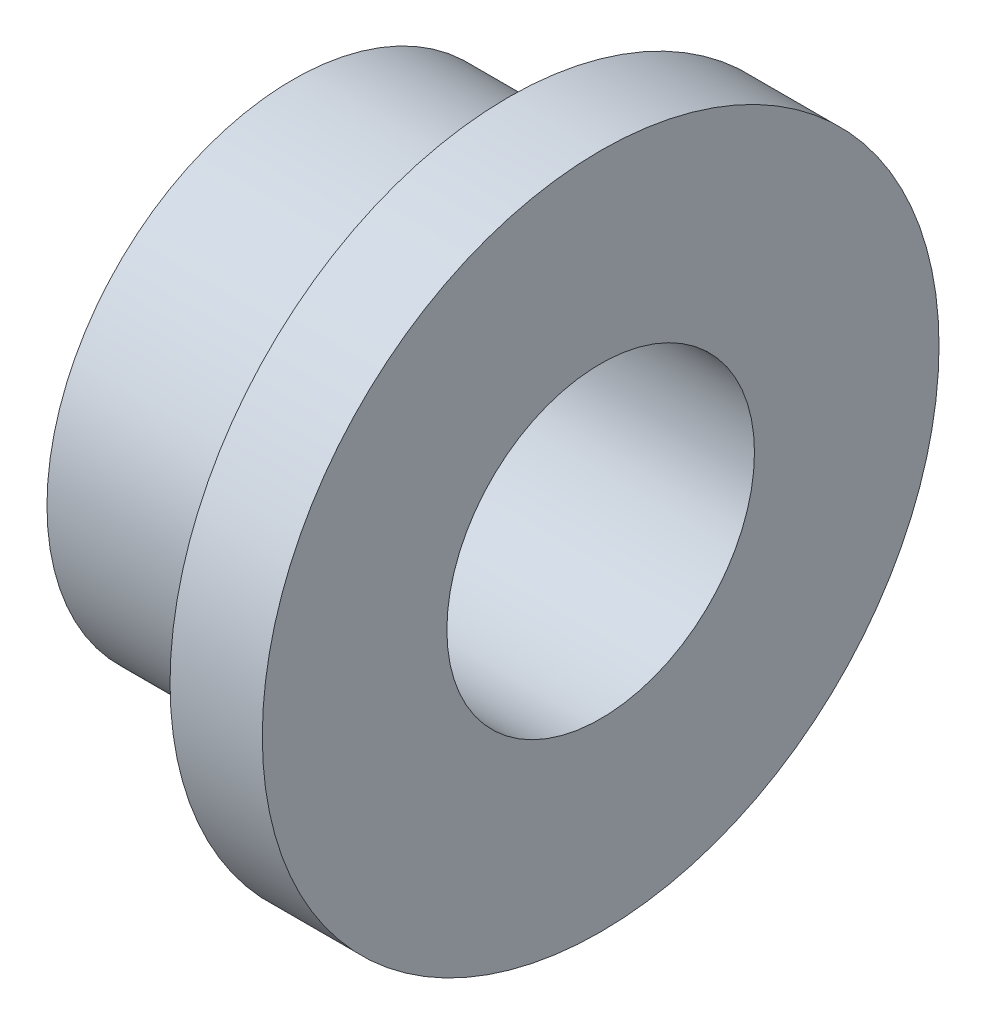
ISO-10303-21;
HEADER;
FILE_DESCRIPTION(('STEP AP214'),'2;1');
FILE_NAME('part.step','',(''),(''),'','','');
FILE_SCHEMA(('AUTOMOTIVE_DESIGN { 1 0 10303 214 1 1 1 1 }'));
ENDSEC;
DATA;
#1=APPLICATION_CONTEXT('core data for automotive mechanical design processes');
#2=APPLICATION_PROTOCOL_DEFINITION('international standard','automotive_design',2000,#1);
#3=PRODUCT_CONTEXT('',#1,'mechanical');
#4=PRODUCT('Part','Part','',(#3));
#5=PRODUCT_RELATED_PRODUCT_CATEGORY('part','',(#4));
#6=PRODUCT_DEFINITION_FORMATION('','',#4);
#7=PRODUCT_DEFINITION_CONTEXT('part definition',#1,'design');
#8=PRODUCT_DEFINITION('design','',#6,#7);
#9=PRODUCT_DEFINITION_SHAPE('','',#8);
#10=(LENGTH_UNIT() NAMED_UNIT(*) SI_UNIT(.MILLI.,.METRE.));
#11=(NAMED_UNIT(*) PLANE_ANGLE_UNIT() SI_UNIT($,.RADIAN.));
#12=(NAMED_UNIT(*) SI_UNIT($,.STERADIAN.) SOLID_ANGLE_UNIT());
#13=UNCERTAINTY_MEASURE_WITH_UNIT(LENGTH_MEASURE(1.E-05),#10,'distance_accuracy_value','');
#14=(GEOMETRIC_REPRESENTATION_CONTEXT(3) GLOBAL_UNCERTAINTY_ASSIGNED_CONTEXT((#13)) GLOBAL_UNIT_ASSIGNED_CONTEXT((#10,
#11,#12)) REPRESENTATION_CONTEXT('',''));
#15=CARTESIAN_POINT('',(0.,0.,0.));
#16=DIRECTION('',(0.,0.,1.));
#17=DIRECTION('',(1.,0.,0.));
#18=AXIS2_PLACEMENT_3D('',#15,#16,#17);
#19=CARTESIAN_POINT('',(0.,5.,0.));
#20=DIRECTION('',(1.,0.,0.));
#21=DIRECTION('',(0.,0.,-1.));
#22=AXIS2_PLACEMENT_3D('',#19,#20,#21);
#23=PLANE('',#22);
#24=CARTESIAN_POINT('',(0.,0.,0.));
#25=DIRECTION('',(-1.,0.,0.));
#26=DIRECTION('',(0.,0.,1.));
#27=AXIS2_PLACEMENT_3D('',#24,#25,#26);
#28=CIRCLE('',#27,5.);
#29=CARTESIAN_POINT('',(0.,0.,5.));
#30=VERTEX_POINT('',#29);
#31=EDGE_CURVE('E70',#30,#30,#28,.T.);
#32=ORIENTED_EDGE('',*,*,#31,.F.);
#33=EDGE_LOOP('',(#32));
#34=FACE_BOUND('',#33,.T.);
#35=CARTESIAN_POINT('',(0.,0.,0.));
#36=DIRECTION('',(-1.,0.,0.));
#37=DIRECTION('',(0.,0.,1.));
#38=AXIS2_PLACEMENT_3D('',#35,#36,#37);
#39=CIRCLE('',#38,8.);
#40=CARTESIAN_POINT('',(0.,0.,8.));
#41=VERTEX_POINT('',#40);
#42=EDGE_CURVE('E10',#41,#41,#39,.T.);
#43=ORIENTED_EDGE('',*,*,#42,.T.);
#44=EDGE_LOOP('',(#43));
#45=FACE_BOUND('',#44,.T.);
#46=ADVANCED_FACE('F43',(#34,#45),#23,.F.);
#47=CARTESIAN_POINT('',(0.,0.,0.));
#48=DIRECTION('',(-1.,0.,0.));
#49=DIRECTION('',(0.,0.,1.));
#50=AXIS2_PLACEMENT_3D('',#47,#48,#49);
#51=CYLINDRICAL_SURFACE('',#50,8.);
#52=ORIENTED_EDGE('',*,*,#42,.F.);
#53=EDGE_LOOP('',(#52));
#54=FACE_BOUND('',#53,.T.);
#55=CARTESIAN_POINT('',(7.,0.,0.));
#56=DIRECTION('',(-1.,0.,0.));
#57=DIRECTION('',(0.,0.,1.));
#58=AXIS2_PLACEMENT_3D('',#55,#56,#57);
#59=CIRCLE('',#58,8.);
#60=CARTESIAN_POINT('',(7.,0.,8.));
#61=VERTEX_POINT('',#60);
#62=EDGE_CURVE('E50',#61,#61,#59,.T.);
#63=ORIENTED_EDGE('',*,*,#62,.T.);
#64=EDGE_LOOP('',(#63));
#65=FACE_BOUND('',#64,.T.);
#66=ADVANCED_FACE('F78',(#54,#65),#51,.T.);
#67=CARTESIAN_POINT('',(7.,8.,0.));
#68=DIRECTION('',(1.,0.,0.));
#69=DIRECTION('',(0.,0.,-1.));
#70=AXIS2_PLACEMENT_3D('',#67,#68,#69);
#71=PLANE('',#70);
#72=ORIENTED_EDGE('',*,*,#62,.F.);
#73=EDGE_LOOP('',(#72));
#74=FACE_BOUND('',#73,.T.);
#75=CARTESIAN_POINT('',(7.,0.,0.));
#76=DIRECTION('',(-1.,0.,0.));
#77=DIRECTION('',(0.,0.,1.));
#78=AXIS2_PLACEMENT_3D('',#75,#76,#77);
#79=CIRCLE('',#78,11.);
#80=CARTESIAN_POINT('',(7.,0.,11.));
#81=VERTEX_POINT('',#80);
#82=EDGE_CURVE('E55',#81,#81,#79,.T.);
#83=ORIENTED_EDGE('',*,*,#82,.T.);
#84=EDGE_LOOP('',(#83));
#85=FACE_BOUND('',#84,.T.);
#86=ADVANCED_FACE('F82',(#74,#85),#71,.F.);
#87=CARTESIAN_POINT('',(0.,0.,0.));
#88=DIRECTION('',(-1.,0.,0.));
#89=DIRECTION('',(0.,0.,1.));
#90=AXIS2_PLACEMENT_3D('',#87,#88,#89);
#91=CYLINDRICAL_SURFACE('',#90,11.);
#92=ORIENTED_EDGE('',*,*,#82,.F.);
#93=EDGE_LOOP('',(#92));
#94=FACE_BOUND('',#93,.T.);
#95=CARTESIAN_POINT('',(10.,0.,0.));
#96=DIRECTION('',(-1.,0.,0.));
#97=DIRECTION('',(0.,0.,1.));
#98=AXIS2_PLACEMENT_3D('',#95,#96,#97);
#99=CIRCLE('',#98,11.);
#100=CARTESIAN_POINT('',(10.,0.,11.));
#101=VERTEX_POINT('',#100);
#102=EDGE_CURVE('E60',#101,#101,#99,.T.);
#103=ORIENTED_EDGE('',*,*,#102,.T.);
#104=EDGE_LOOP('',(#103));
#105=FACE_BOUND('',#104,.T.);
#106=ADVANCED_FACE('F87',(#94,#105),#91,.T.);
#107=CARTESIAN_POINT('',(10.,11.,0.));
#108=DIRECTION('',(-1.,0.,0.));
#109=DIRECTION('',(0.,0.,1.));
#110=AXIS2_PLACEMENT_3D('',#107,#108,#109);
#111=PLANE('',#110);
#112=ORIENTED_EDGE('',*,*,#102,.F.);
#113=EDGE_LOOP('',(#112));
#114=FACE_BOUND('',#113,.T.);
#115=CARTESIAN_POINT('',(10.,0.,0.));
#116=DIRECTION('',(-1.,0.,0.));
#117=DIRECTION('',(0.,0.,1.));
#118=AXIS2_PLACEMENT_3D('',#115,#116,#117);
#119=CIRCLE('',#118,5.);
#120=CARTESIAN_POINT('',(10.,0.,5.));
#121=VERTEX_POINT('',#120);
#122=EDGE_CURVE('E66',#121,#121,#119,.T.);
#123=ORIENTED_EDGE('',*,*,#122,.T.);
#124=EDGE_LOOP('',(#123));
#125=FACE_BOUND('',#124,.T.);
#126=ADVANCED_FACE('F93',(#114,#125),#111,.F.);
#127=CARTESIAN_POINT('',(0.,0.,0.));
#128=DIRECTION('',(-1.,0.,0.));
#129=DIRECTION('',(0.,0.,1.));
#130=AXIS2_PLACEMENT_3D('',#127,#128,#129);
#131=CYLINDRICAL_SURFACE('',#130,5.);
#132=ORIENTED_EDGE('',*,*,#122,.F.);
#133=EDGE_LOOP('',(#132));
#134=FACE_BOUND('',#133,.T.);
#135=ORIENTED_EDGE('',*,*,#31,.T.);
#136=EDGE_LOOP('',(#135));
#137=FACE_BOUND('',#136,.T.);
#138=ADVANCED_FACE('F75',(#134,#137),#131,.F.);
#139=CLOSED_SHELL('',(#46,#66,#86,#106,#126,#138));
#140=MANIFOLD_SOLID_BREP('B2',#139);
#141=ADVANCED_BREP_SHAPE_REPRESENTATION('',(#18,#140),#14);
#142=SHAPE_DEFINITION_REPRESENTATION(#9,#141);
ENDSEC;
END-ISO-10303-21;
